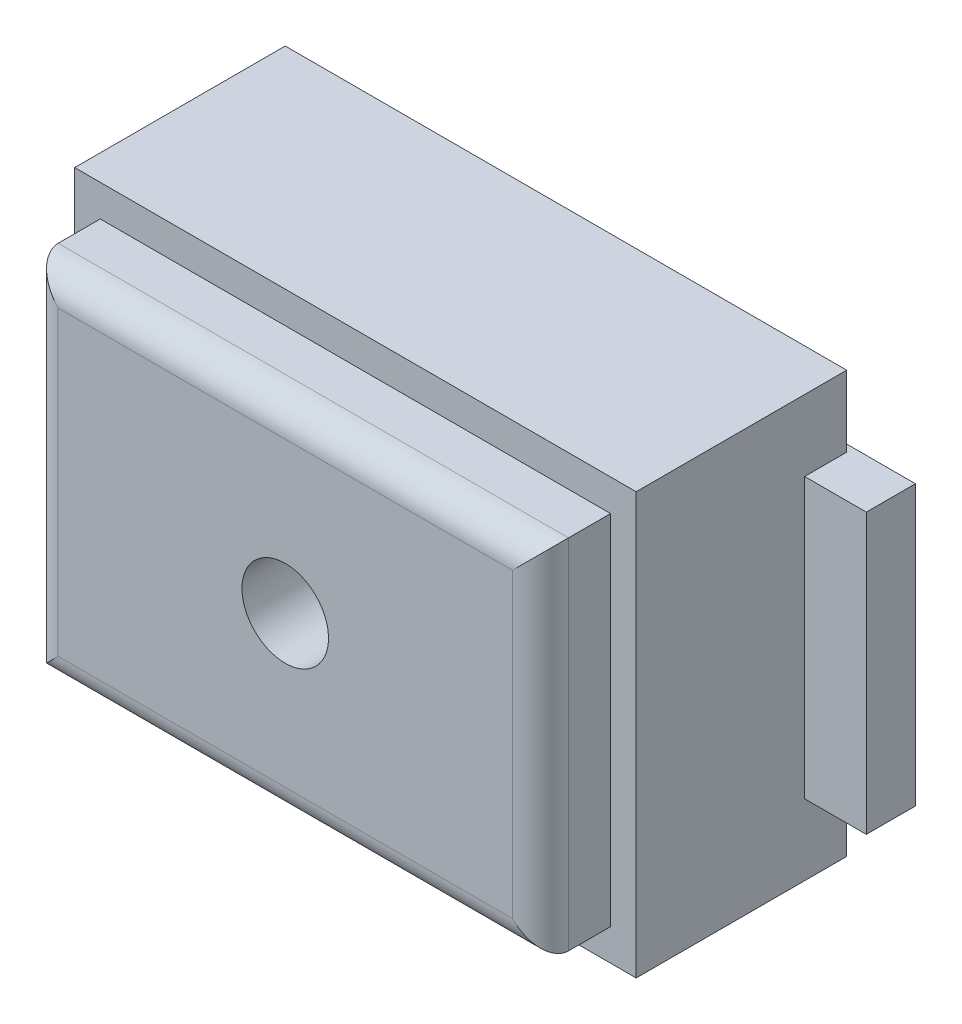
ISO-10303-21;
HEADER;
FILE_DESCRIPTION(('STEP AP214'),'2;1');
FILE_NAME('part.step','',(''),(''),'','','');
FILE_SCHEMA(('AUTOMOTIVE_DESIGN { 1 0 10303 214 1 1 1 1 }'));
ENDSEC;
DATA;
#1=APPLICATION_CONTEXT('core data for automotive mechanical design processes');
#2=APPLICATION_PROTOCOL_DEFINITION('international standard','automotive_design',2000,#1);
#3=PRODUCT_CONTEXT('',#1,'mechanical');
#4=PRODUCT('Part','Part','',(#3));
#5=PRODUCT_RELATED_PRODUCT_CATEGORY('part','',(#4));
#6=PRODUCT_DEFINITION_FORMATION('','',#4);
#7=PRODUCT_DEFINITION_CONTEXT('part definition',#1,'design');
#8=PRODUCT_DEFINITION('design','',#6,#7);
#9=PRODUCT_DEFINITION_SHAPE('','',#8);
#10=(LENGTH_UNIT() NAMED_UNIT(*) SI_UNIT(.MILLI.,.METRE.));
#11=(NAMED_UNIT(*) PLANE_ANGLE_UNIT() SI_UNIT($,.RADIAN.));
#12=(NAMED_UNIT(*) SI_UNIT($,.STERADIAN.) SOLID_ANGLE_UNIT());
#13=UNCERTAINTY_MEASURE_WITH_UNIT(LENGTH_MEASURE(1.E-05),#10,'distance_accuracy_value','');
#14=(GEOMETRIC_REPRESENTATION_CONTEXT(3) GLOBAL_UNCERTAINTY_ASSIGNED_CONTEXT((#13)) GLOBAL_UNIT_ASSIGNED_CONTEXT((#10,
#11,#12)) REPRESENTATION_CONTEXT('',''));
#15=CARTESIAN_POINT('',(0.,0.,0.));
#16=DIRECTION('',(0.,0.,1.));
#17=DIRECTION('',(1.,0.,0.));
#18=AXIS2_PLACEMENT_3D('',#15,#16,#17);
#19=CARTESIAN_POINT('',(0.,0.,1.5));
#20=DIRECTION('',(0.,0.,1.));
#21=DIRECTION('',(1.,0.,0.));
#22=AXIS2_PLACEMENT_3D('',#19,#20,#21);
#23=PLANE('',#22);
#24=DIRECTION('',(0.,-1.,0.));
#25=VECTOR('',#24,1.);
#26=CARTESIAN_POINT('',(-2.00000000000002,-1.50000000000001,1.5));
#27=LINE('',#26,#25);
#28=CARTESIAN_POINT('',(-2.00000000000002,1.5,1.5));
#29=VERTEX_POINT('',#28);
#30=CARTESIAN_POINT('',(-2.00000000000002,-1.50000000000001,1.5));
#31=VERTEX_POINT('',#30);
#32=EDGE_CURVE('E290',#29,#31,#27,.T.);
#33=ORIENTED_EDGE('',*,*,#32,.T.);
#34=DIRECTION('',(1.,0.,0.));
#35=VECTOR('',#34,1.);
#36=CARTESIAN_POINT('',(1.99999999999999,-1.5,1.5));
#37=LINE('',#36,#35);
#38=CARTESIAN_POINT('',(1.99999999999999,-1.5,1.5));
#39=VERTEX_POINT('',#38);
#40=EDGE_CURVE('E293',#31,#39,#37,.T.);
#41=ORIENTED_EDGE('',*,*,#40,.T.);
#42=DIRECTION('',(0.,1.,0.));
#43=VECTOR('',#42,1.);
#44=CARTESIAN_POINT('',(1.99999999999999,-1.5,1.5));
#45=LINE('',#44,#43);
#46=CARTESIAN_POINT('',(1.99999999999999,1.5,1.5));
#47=VERTEX_POINT('',#46);
#48=EDGE_CURVE('E296',#39,#47,#45,.T.);
#49=ORIENTED_EDGE('',*,*,#48,.T.);
#50=DIRECTION('',(-1.,0.,0.));
#51=VECTOR('',#50,1.);
#52=CARTESIAN_POINT('',(1.99999999999999,1.5,1.5));
#53=LINE('',#52,#51);
#54=EDGE_CURVE('E298',#47,#29,#53,.T.);
#55=ORIENTED_EDGE('',*,*,#54,.T.);
#56=EDGE_LOOP('',(#33,#41,#49,#55));
#57=FACE_BOUND('',#56,.T.);
#58=DIRECTION('',(0.,-1.,0.));
#59=VECTOR('',#58,1.);
#60=CARTESIAN_POINT('',(1.8176505170228,0.,1.5));
#61=LINE('',#60,#59);
#62=CARTESIAN_POINT('',(1.8176505170228,1.27419757527779,1.5));
#63=VERTEX_POINT('',#62);
#64=CARTESIAN_POINT('',(1.8176505170228,-1.27419757527779,1.5));
#65=VERTEX_POINT('',#64);
#66=EDGE_CURVE('E278',#63,#65,#61,.T.);
#67=ORIENTED_EDGE('',*,*,#66,.T.);
#68=DIRECTION('',(-1.,0.,0.));
#69=VECTOR('',#68,1.);
#70=CARTESIAN_POINT('',(0.,-1.27419757527779,1.5));
#71=LINE('',#70,#69);
#72=CARTESIAN_POINT('',(-1.8176505170228,-1.27419757527779,1.5));
#73=VERTEX_POINT('',#72);
#74=EDGE_CURVE('E268',#65,#73,#71,.T.);
#75=ORIENTED_EDGE('',*,*,#74,.T.);
#76=DIRECTION('',(0.,1.,0.));
#77=VECTOR('',#76,1.);
#78=CARTESIAN_POINT('',(-1.8176505170228,0.,1.5));
#79=LINE('',#78,#77);
#80=CARTESIAN_POINT('',(-1.8176505170228,1.27419757527779,1.5));
#81=VERTEX_POINT('',#80);
#82=EDGE_CURVE('E271',#73,#81,#79,.T.);
#83=ORIENTED_EDGE('',*,*,#82,.T.);
#84=DIRECTION('',(1.,0.,0.));
#85=VECTOR('',#84,1.);
#86=CARTESIAN_POINT('',(0.,1.27419757527779,1.5));
#87=LINE('',#86,#85);
#88=EDGE_CURVE('E275',#81,#63,#87,.T.);
#89=ORIENTED_EDGE('',*,*,#88,.T.);
#90=EDGE_LOOP('',(#67,#75,#83,#89));
#91=FACE_BOUND('',#90,.T.);
#92=ADVANCED_FACE('F35',(#57,#91),#23,.T.);
#93=CARTESIAN_POINT('',(-2.00000000000002,-1.50000000000001,1.5));
#94=DIRECTION('',(1.,0.,0.));
#95=DIRECTION('',(0.,0.,-1.));
#96=AXIS2_PLACEMENT_3D('',#93,#94,#95);
#97=PLANE('',#96);
#98=DIRECTION('',(0.,1.,0.));
#99=VECTOR('',#98,1.);
#100=CARTESIAN_POINT('',(-2.00000000000002,-1.50000000000001,0.3));
#101=LINE('',#100,#99);
#102=CARTESIAN_POINT('',(-2.00000000000002,-0.99421686042956,0.3));
#103=VERTEX_POINT('',#102);
#104=CARTESIAN_POINT('',(-2.00000000000002,0.994216860429553,0.3));
#105=VERTEX_POINT('',#104);
#106=EDGE_CURVE('E11',#103,#105,#101,.T.);
#107=ORIENTED_EDGE('',*,*,#106,.F.);
#108=DIRECTION('',(0.,0.,-1.));
#109=VECTOR('',#108,1.);
#110=CARTESIAN_POINT('',(-2.00000000000002,-0.99421686042956,1.5));
#111=LINE('',#110,#109);
#112=CARTESIAN_POINT('',(-2.00000000000002,-0.99421686042956,0.));
#113=VERTEX_POINT('',#112);
#114=EDGE_CURVE('E224',#103,#113,#111,.T.);
#115=ORIENTED_EDGE('',*,*,#114,.T.);
#116=DIRECTION('',(0.,-1.,0.));
#117=VECTOR('',#116,1.);
#118=CARTESIAN_POINT('',(-2.00000000000002,-1.50000000000001,0.));
#119=LINE('',#118,#117);
#120=CARTESIAN_POINT('',(-2.00000000000002,-1.50000000000001,0.));
#121=VERTEX_POINT('',#120);
#122=EDGE_CURVE('E284',#113,#121,#119,.T.);
#123=ORIENTED_EDGE('',*,*,#122,.T.);
#124=DIRECTION('',(0.,0.,-1.));
#125=VECTOR('',#124,1.);
#126=CARTESIAN_POINT('',(-2.00000000000002,-1.50000000000001,1.5));
#127=LINE('',#126,#125);
#128=EDGE_CURVE('E319',#31,#121,#127,.T.);
#129=ORIENTED_EDGE('',*,*,#128,.F.);
#130=ORIENTED_EDGE('',*,*,#32,.F.);
#131=DIRECTION('',(0.,0.,-1.));
#132=VECTOR('',#131,1.);
#133=CARTESIAN_POINT('',(-2.00000000000002,1.5,1.5));
#134=LINE('',#133,#132);
#135=CARTESIAN_POINT('',(-2.00000000000002,1.5,0.));
#136=VERTEX_POINT('',#135);
#137=EDGE_CURVE('E300',#29,#136,#134,.T.);
#138=ORIENTED_EDGE('',*,*,#137,.T.);
#139=CARTESIAN_POINT('',(-2.00000000000002,0.994216860429553,0.));
#140=VERTEX_POINT('',#139);
#141=EDGE_CURVE('E301',#136,#140,#119,.T.);
#142=ORIENTED_EDGE('',*,*,#141,.T.);
#143=DIRECTION('',(0.,0.,1.));
#144=VECTOR('',#143,1.);
#145=CARTESIAN_POINT('',(-2.00000000000002,0.994216860429553,1.5));
#146=LINE('',#145,#144);
#147=EDGE_CURVE('E50',#140,#105,#146,.T.);
#148=ORIENTED_EDGE('',*,*,#147,.T.);
#149=EDGE_LOOP('',(#107,#115,#123,#129,#130,#138,#142,#148));
#150=FACE_BOUND('',#149,.T.);
#151=ADVANCED_FACE('F371',(#150),#97,.F.);
#152=CARTESIAN_POINT('',(1.99999999999999,-1.5,1.5));
#153=DIRECTION('',(0.,1.,0.));
#154=DIRECTION('',(-1.,0.,0.));
#155=AXIS2_PLACEMENT_3D('',#152,#153,#154);
#156=PLANE('',#155);
#157=DIRECTION('',(1.,0.,0.));
#158=VECTOR('',#157,1.);
#159=CARTESIAN_POINT('',(1.99999999999999,-1.5,0.));
#160=LINE('',#159,#158);
#161=CARTESIAN_POINT('',(1.99999999999999,-1.5,0.));
#162=VERTEX_POINT('',#161);
#163=EDGE_CURVE('E304',#121,#162,#160,.T.);
#164=ORIENTED_EDGE('',*,*,#163,.T.);
#165=DIRECTION('',(0.,0.,-1.));
#166=VECTOR('',#165,1.);
#167=CARTESIAN_POINT('',(1.99999999999999,-1.5,1.5));
#168=LINE('',#167,#166);
#169=EDGE_CURVE('E316',#39,#162,#168,.T.);
#170=ORIENTED_EDGE('',*,*,#169,.F.);
#171=ORIENTED_EDGE('',*,*,#40,.F.);
#172=ORIENTED_EDGE('',*,*,#128,.T.);
#173=EDGE_LOOP('',(#164,#170,#171,#172));
#174=FACE_BOUND('',#173,.T.);
#175=ADVANCED_FACE('F398',(#174),#156,.F.);
#176=CARTESIAN_POINT('',(1.99999999999999,-1.5,1.5));
#177=DIRECTION('',(-1.,0.,0.));
#178=DIRECTION('',(0.,0.,1.));
#179=AXIS2_PLACEMENT_3D('',#176,#177,#178);
#180=PLANE('',#179);
#181=DIRECTION('',(0.,1.,0.));
#182=VECTOR('',#181,1.);
#183=CARTESIAN_POINT('',(1.99999999999999,-1.5,0.));
#184=LINE('',#183,#182);
#185=CARTESIAN_POINT('',(1.99999999999999,-0.99421686042956,0.));
#186=VERTEX_POINT('',#185);
#187=EDGE_CURVE('E307',#162,#186,#184,.T.);
#188=ORIENTED_EDGE('',*,*,#187,.T.);
#189=DIRECTION('',(0.,0.,1.));
#190=VECTOR('',#189,1.);
#191=CARTESIAN_POINT('',(1.99999999999999,-0.99421686042956,1.5));
#192=LINE('',#191,#190);
#193=CARTESIAN_POINT('',(1.99999999999999,-0.99421686042956,0.3));
#194=VERTEX_POINT('',#193);
#195=EDGE_CURVE('E258',#186,#194,#192,.T.);
#196=ORIENTED_EDGE('',*,*,#195,.T.);
#197=DIRECTION('',(0.,-1.,0.));
#198=VECTOR('',#197,1.);
#199=CARTESIAN_POINT('',(1.99999999999999,-1.5,0.3));
#200=LINE('',#199,#198);
#201=CARTESIAN_POINT('',(1.99999999999999,0.994216860429553,0.3));
#202=VERTEX_POINT('',#201);
#203=EDGE_CURVE('E357',#202,#194,#200,.T.);
#204=ORIENTED_EDGE('',*,*,#203,.F.);
#205=DIRECTION('',(0.,0.,-1.));
#206=VECTOR('',#205,1.);
#207=CARTESIAN_POINT('',(1.99999999999999,0.994216860429553,1.5));
#208=LINE('',#207,#206);
#209=CARTESIAN_POINT('',(1.99999999999999,0.994216860429553,0.));
#210=VERTEX_POINT('',#209);
#211=EDGE_CURVE('E250',#202,#210,#208,.T.);
#212=ORIENTED_EDGE('',*,*,#211,.T.);
#213=CARTESIAN_POINT('',(1.99999999999999,1.5,0.));
#214=VERTEX_POINT('',#213);
#215=EDGE_CURVE('E306',#210,#214,#184,.T.);
#216=ORIENTED_EDGE('',*,*,#215,.T.);
#217=DIRECTION('',(0.,0.,-1.));
#218=VECTOR('',#217,1.);
#219=CARTESIAN_POINT('',(1.99999999999999,1.5,1.5));
#220=LINE('',#219,#218);
#221=EDGE_CURVE('E313',#47,#214,#220,.T.);
#222=ORIENTED_EDGE('',*,*,#221,.F.);
#223=ORIENTED_EDGE('',*,*,#48,.F.);
#224=ORIENTED_EDGE('',*,*,#169,.T.);
#225=EDGE_LOOP('',(#188,#196,#204,#212,#216,#222,#223,#224));
#226=FACE_BOUND('',#225,.T.);
#227=ADVANCED_FACE('F410',(#226),#180,.F.);
#228=CARTESIAN_POINT('',(1.99999999999999,1.5,1.5));
#229=DIRECTION('',(0.,-1.,0.));
#230=DIRECTION('',(1.,0.,0.));
#231=AXIS2_PLACEMENT_3D('',#228,#229,#230);
#232=PLANE('',#231);
#233=DIRECTION('',(-1.,0.,0.));
#234=VECTOR('',#233,1.);
#235=CARTESIAN_POINT('',(1.99999999999999,1.5,0.));
#236=LINE('',#235,#234);
#237=EDGE_CURVE('E294',#214,#136,#236,.T.);
#238=ORIENTED_EDGE('',*,*,#237,.T.);
#239=ORIENTED_EDGE('',*,*,#137,.F.);
#240=ORIENTED_EDGE('',*,*,#54,.F.);
#241=ORIENTED_EDGE('',*,*,#221,.T.);
#242=EDGE_LOOP('',(#238,#239,#240,#241));
#243=FACE_BOUND('',#242,.T.);
#244=ADVANCED_FACE('F407',(#243),#232,.F.);
#245=CARTESIAN_POINT('',(0.,0.,0.));
#246=DIRECTION('',(0.,0.,1.));
#247=DIRECTION('',(1.,0.,0.));
#248=AXIS2_PLACEMENT_3D('',#245,#246,#247);
#249=PLANE('',#248);
#250=ORIENTED_EDGE('',*,*,#122,.F.);
#251=DIRECTION('',(1.,0.,0.));
#252=VECTOR('',#251,1.);
#253=CARTESIAN_POINT('',(0.,-0.99421686042956,0.));
#254=LINE('',#253,#252);
#255=CARTESIAN_POINT('',(-1.58269945819022,-0.99421686042956,0.));
#256=VERTEX_POINT('',#255);
#257=EDGE_CURVE('E43',#113,#256,#254,.T.);
#258=ORIENTED_EDGE('',*,*,#257,.T.);
#259=DIRECTION('',(0.,1.,0.));
#260=VECTOR('',#259,1.);
#261=CARTESIAN_POINT('',(-1.58269945819022,0.,0.));
#262=LINE('',#261,#260);
#263=CARTESIAN_POINT('',(-1.58269945819022,0.994216860429553,0.));
#264=VERTEX_POINT('',#263);
#265=EDGE_CURVE('E361',#256,#264,#262,.T.);
#266=ORIENTED_EDGE('',*,*,#265,.T.);
#267=DIRECTION('',(-1.,0.,0.));
#268=VECTOR('',#267,1.);
#269=CARTESIAN_POINT('',(0.,0.994216860429553,0.));
#270=LINE('',#269,#268);
#271=EDGE_CURVE('E359',#264,#140,#270,.T.);
#272=ORIENTED_EDGE('',*,*,#271,.T.);
#273=ORIENTED_EDGE('',*,*,#141,.F.);
#274=ORIENTED_EDGE('',*,*,#237,.F.);
#275=ORIENTED_EDGE('',*,*,#215,.F.);
#276=DIRECTION('',(-1.,0.,0.));
#277=VECTOR('',#276,1.);
#278=CARTESIAN_POINT('',(0.,0.994216860429553,0.));
#279=LINE('',#278,#277);
#280=CARTESIAN_POINT('',(1.56042903451278,0.994216860429553,0.));
#281=VERTEX_POINT('',#280);
#282=EDGE_CURVE('E340',#210,#281,#279,.T.);
#283=ORIENTED_EDGE('',*,*,#282,.T.);
#284=DIRECTION('',(0.,-1.,0.));
#285=VECTOR('',#284,1.);
#286=CARTESIAN_POINT('',(1.56042903451278,0.,0.));
#287=LINE('',#286,#285);
#288=CARTESIAN_POINT('',(1.56042903451278,-0.99421686042956,0.));
#289=VERTEX_POINT('',#288);
#290=EDGE_CURVE('E351',#281,#289,#287,.T.);
#291=ORIENTED_EDGE('',*,*,#290,.T.);
#292=DIRECTION('',(1.,0.,0.));
#293=VECTOR('',#292,1.);
#294=CARTESIAN_POINT('',(0.,-0.99421686042956,0.));
#295=LINE('',#294,#293);
#296=EDGE_CURVE('E354',#289,#186,#295,.T.);
#297=ORIENTED_EDGE('',*,*,#296,.T.);
#298=ORIENTED_EDGE('',*,*,#187,.F.);
#299=ORIENTED_EDGE('',*,*,#163,.F.);
#300=EDGE_LOOP('',(#250,#258,#266,#272,#273,#274,#275,#283,#291,#297,#298,#299));
#301=FACE_BOUND('',#300,.T.);
#302=ADVANCED_FACE('F366',(#301),#249,.F.);
#303=CARTESIAN_POINT('',(0.,-1.27419757527779,2.));
#304=DIRECTION('',(0.,-1.,0.));
#305=DIRECTION('',(0.,0.,-1.));
#306=AXIS2_PLACEMENT_3D('',#303,#304,#305);
#307=PLANE('',#306);
#308=DIRECTION('',(0.,0.,-1.));
#309=VECTOR('',#308,1.);
#310=CARTESIAN_POINT('',(1.8176505170228,-1.27419757527779,2.));
#311=LINE('',#310,#309);
#312=CARTESIAN_POINT('',(1.8176505170228,-1.27419757527779,1.8));
#313=VERTEX_POINT('',#312);
#314=EDGE_CURVE('E282',#313,#65,#311,.T.);
#315=ORIENTED_EDGE('',*,*,#314,.F.);
#316=DIRECTION('',(-1.,0.,0.));
#317=VECTOR('',#316,1.);
#318=CARTESIAN_POINT('',(-1.8176505170228,-1.27419757527779,1.8));
#319=LINE('',#318,#317);
#320=CARTESIAN_POINT('',(-1.8176505170228,-1.27419757527779,1.8));
#321=VERTEX_POINT('',#320);
#322=EDGE_CURVE('E334',#313,#321,#319,.T.);
#323=ORIENTED_EDGE('',*,*,#322,.T.);
#324=DIRECTION('',(0.,0.,-1.));
#325=VECTOR('',#324,1.);
#326=CARTESIAN_POINT('',(-1.8176505170228,-1.27419757527779,2.));
#327=LINE('',#326,#325);
#328=EDGE_CURVE('E281',#321,#73,#327,.T.);
#329=ORIENTED_EDGE('',*,*,#328,.T.);
#330=ORIENTED_EDGE('',*,*,#74,.F.);
#331=EDGE_LOOP('',(#315,#323,#329,#330));
#332=FACE_BOUND('',#331,.T.);
#333=ADVANCED_FACE('F403',(#332),#307,.T.);
#334=CARTESIAN_POINT('',(1.8176505170228,0.,2.));
#335=DIRECTION('',(1.,0.,0.));
#336=DIRECTION('',(0.,0.,-1.));
#337=AXIS2_PLACEMENT_3D('',#334,#335,#336);
#338=PLANE('',#337);
#339=DIRECTION('',(0.,0.,-1.));
#340=VECTOR('',#339,1.);
#341=CARTESIAN_POINT('',(1.8176505170228,1.27419757527779,2.));
#342=LINE('',#341,#340);
#343=CARTESIAN_POINT('',(1.8176505170228,1.27419757527779,1.8));
#344=VERTEX_POINT('',#343);
#345=EDGE_CURVE('E285',#344,#63,#342,.T.);
#346=ORIENTED_EDGE('',*,*,#345,.F.);
#347=DIRECTION('',(0.,-1.,0.));
#348=VECTOR('',#347,1.);
#349=CARTESIAN_POINT('',(1.8176505170228,-1.27419757527779,1.8));
#350=LINE('',#349,#348);
#351=EDGE_CURVE('E322',#344,#313,#350,.T.);
#352=ORIENTED_EDGE('',*,*,#351,.T.);
#353=ORIENTED_EDGE('',*,*,#314,.T.);
#354=ORIENTED_EDGE('',*,*,#66,.F.);
#355=EDGE_LOOP('',(#346,#352,#353,#354));
#356=FACE_BOUND('',#355,.T.);
#357=ADVANCED_FACE('F452',(#356),#338,.T.);
#358=CARTESIAN_POINT('',(0.,1.27419757527779,2.));
#359=DIRECTION('',(0.,1.,0.));
#360=DIRECTION('',(0.,0.,1.));
#361=AXIS2_PLACEMENT_3D('',#358,#359,#360);
#362=PLANE('',#361);
#363=DIRECTION('',(0.,0.,-1.));
#364=VECTOR('',#363,1.);
#365=CARTESIAN_POINT('',(-1.8176505170228,1.27419757527779,2.));
#366=LINE('',#365,#364);
#367=CARTESIAN_POINT('',(-1.8176505170228,1.27419757527779,1.8));
#368=VERTEX_POINT('',#367);
#369=EDGE_CURVE('E287',#368,#81,#366,.T.);
#370=ORIENTED_EDGE('',*,*,#369,.F.);
#371=DIRECTION('',(1.,0.,0.));
#372=VECTOR('',#371,1.);
#373=CARTESIAN_POINT('',(1.8176505170228,1.27419757527779,1.8));
#374=LINE('',#373,#372);
#375=EDGE_CURVE('E338',#368,#344,#374,.T.);
#376=ORIENTED_EDGE('',*,*,#375,.T.);
#377=ORIENTED_EDGE('',*,*,#345,.T.);
#378=ORIENTED_EDGE('',*,*,#88,.F.);
#379=EDGE_LOOP('',(#370,#376,#377,#378));
#380=FACE_BOUND('',#379,.T.);
#381=ADVANCED_FACE('F459',(#380),#362,.T.);
#382=CARTESIAN_POINT('',(-1.8176505170228,0.,2.));
#383=DIRECTION('',(-1.,0.,0.));
#384=DIRECTION('',(0.,0.,1.));
#385=AXIS2_PLACEMENT_3D('',#382,#383,#384);
#386=PLANE('',#385);
#387=ORIENTED_EDGE('',*,*,#328,.F.);
#388=DIRECTION('',(0.,1.,0.));
#389=VECTOR('',#388,1.);
#390=CARTESIAN_POINT('',(-1.8176505170228,1.27419757527779,1.8));
#391=LINE('',#390,#389);
#392=EDGE_CURVE('E336',#321,#368,#391,.T.);
#393=ORIENTED_EDGE('',*,*,#392,.T.);
#394=ORIENTED_EDGE('',*,*,#369,.T.);
#395=ORIENTED_EDGE('',*,*,#82,.F.);
#396=EDGE_LOOP('',(#387,#393,#394,#395));
#397=FACE_BOUND('',#396,.T.);
#398=ADVANCED_FACE('F461',(#397),#386,.T.);
#399=CARTESIAN_POINT('',(0.,0.,2.));
#400=DIRECTION('',(0.,0.,-1.));
#401=DIRECTION('',(-1.,0.,0.));
#402=AXIS2_PLACEMENT_3D('',#399,#400,#401);
#403=PLANE('',#402);
#404=CARTESIAN_POINT('',(0.,0.,2.));
#405=DIRECTION('',(0.,0.,-1.));
#406=DIRECTION('',(-1.,0.,0.));
#407=AXIS2_PLACEMENT_3D('',#404,#405,#406);
#408=CIRCLE('',#407,0.308254007567541);
#409=CARTESIAN_POINT('',(-0.308254007567541,0.,2.));
#410=VERTEX_POINT('',#409);
#411=EDGE_CURVE('E261',#410,#410,#408,.T.);
#412=ORIENTED_EDGE('',*,*,#411,.T.);
#413=EDGE_LOOP('',(#412));
#414=FACE_BOUND('',#413,.T.);
#415=DIRECTION('',(-1.,0.,0.));
#416=VECTOR('',#415,1.);
#417=CARTESIAN_POINT('',(1.8176505170228,-1.07419757527779,2.));
#418=LINE('',#417,#416);
#419=CARTESIAN_POINT('',(-1.6176505170228,-1.07419757527779,2.));
#420=VERTEX_POINT('',#419);
#421=CARTESIAN_POINT('',(1.6176505170228,-1.07419757527779,2.));
#422=VERTEX_POINT('',#421);
#423=EDGE_CURVE('E329',#420,#422,#418,.F.);
#424=ORIENTED_EDGE('',*,*,#423,.T.);
#425=DIRECTION('',(0.,-1.,0.));
#426=VECTOR('',#425,1.);
#427=CARTESIAN_POINT('',(1.6176505170228,1.27419757527779,2.));
#428=LINE('',#427,#426);
#429=CARTESIAN_POINT('',(1.6176505170228,1.07419757527779,2.));
#430=VERTEX_POINT('',#429);
#431=EDGE_CURVE('E331',#422,#430,#428,.F.);
#432=ORIENTED_EDGE('',*,*,#431,.T.);
#433=DIRECTION('',(1.,0.,0.));
#434=VECTOR('',#433,1.);
#435=CARTESIAN_POINT('',(-1.8176505170228,1.07419757527779,2.));
#436=LINE('',#435,#434);
#437=CARTESIAN_POINT('',(-1.6176505170228,1.07419757527779,2.));
#438=VERTEX_POINT('',#437);
#439=EDGE_CURVE('E325',#430,#438,#436,.F.);
#440=ORIENTED_EDGE('',*,*,#439,.T.);
#441=DIRECTION('',(0.,1.,0.));
#442=VECTOR('',#441,1.);
#443=CARTESIAN_POINT('',(-1.6176505170228,-1.27419757527779,2.));
#444=LINE('',#443,#442);
#445=EDGE_CURVE('E327',#438,#420,#444,.F.);
#446=ORIENTED_EDGE('',*,*,#445,.T.);
#447=EDGE_LOOP('',(#424,#432,#440,#446));
#448=FACE_BOUND('',#447,.T.);
#449=ADVANCED_FACE('F432',(#414,#448),#403,.F.);
#450=CARTESIAN_POINT('',(-1.6176505170228,0.,1.8));
#451=DIRECTION('',(0.,-1.,0.));
#452=DIRECTION('',(0.,0.,-1.));
#453=AXIS2_PLACEMENT_3D('',#450,#451,#452);
#454=CYLINDRICAL_SURFACE('',#453,0.2);
#455=CARTESIAN_POINT('',(-1.6176505170228,-1.07419757527779,1.8));
#456=DIRECTION('',(0.707106781186547,-0.707106781186547,0.));
#457=DIRECTION('',(-0.707106781186547,-0.707106781186547,0.));
#458=AXIS2_PLACEMENT_3D('',#455,#456,#457);
#459=ELLIPSE('',#458,0.282842712474619,0.2);
#460=EDGE_CURVE('E344',#420,#321,#459,.T.);
#461=ORIENTED_EDGE('',*,*,#460,.F.);
#462=ORIENTED_EDGE('',*,*,#445,.F.);
#463=CARTESIAN_POINT('',(-1.6176505170228,1.07419757527779,1.8));
#464=DIRECTION('',(-0.707106781186547,-0.707106781186547,0.));
#465=DIRECTION('',(-0.707106781186547,0.707106781186547,0.));
#466=AXIS2_PLACEMENT_3D('',#463,#464,#465);
#467=ELLIPSE('',#466,0.282842712474619,0.2);
#468=EDGE_CURVE('E272',#368,#438,#467,.F.);
#469=ORIENTED_EDGE('',*,*,#468,.F.);
#470=ORIENTED_EDGE('',*,*,#392,.F.);
#471=EDGE_LOOP('',(#461,#462,#469,#470));
#472=FACE_BOUND('',#471,.T.);
#473=ADVANCED_FACE('F37',(#472),#454,.T.);
#474=CARTESIAN_POINT('',(0.,1.07419757527779,1.8));
#475=DIRECTION('',(-1.,0.,0.));
#476=DIRECTION('',(0.,0.,1.));
#477=AXIS2_PLACEMENT_3D('',#474,#475,#476);
#478=CYLINDRICAL_SURFACE('',#477,0.2);
#479=ORIENTED_EDGE('',*,*,#468,.T.);
#480=ORIENTED_EDGE('',*,*,#439,.F.);
#481=CARTESIAN_POINT('',(1.6176505170228,1.07419757527779,1.8));
#482=DIRECTION('',(-0.707106781186547,0.707106781186547,0.));
#483=DIRECTION('',(-0.707106781186547,-0.707106781186547,0.));
#484=AXIS2_PLACEMENT_3D('',#481,#482,#483);
#485=ELLIPSE('',#484,0.282842712474619,0.2);
#486=EDGE_CURVE('E342',#344,#430,#485,.F.);
#487=ORIENTED_EDGE('',*,*,#486,.F.);
#488=ORIENTED_EDGE('',*,*,#375,.F.);
#489=EDGE_LOOP('',(#479,#480,#487,#488));
#490=FACE_BOUND('',#489,.T.);
#491=ADVANCED_FACE('F425',(#490),#478,.T.);
#492=CARTESIAN_POINT('',(0.,-1.07419757527779,1.8));
#493=DIRECTION('',(1.,0.,0.));
#494=DIRECTION('',(0.,0.,-1.));
#495=AXIS2_PLACEMENT_3D('',#492,#493,#494);
#496=CYLINDRICAL_SURFACE('',#495,0.2);
#497=ORIENTED_EDGE('',*,*,#460,.T.);
#498=ORIENTED_EDGE('',*,*,#322,.F.);
#499=CARTESIAN_POINT('',(1.6176505170228,-1.07419757527779,1.8));
#500=DIRECTION('',(0.707106781186547,0.707106781186547,0.));
#501=DIRECTION('',(0.707106781186547,-0.707106781186547,0.));
#502=AXIS2_PLACEMENT_3D('',#499,#500,#501);
#503=ELLIPSE('',#502,0.282842712474619,0.2);
#504=EDGE_CURVE('E265',#422,#313,#503,.T.);
#505=ORIENTED_EDGE('',*,*,#504,.F.);
#506=ORIENTED_EDGE('',*,*,#423,.F.);
#507=EDGE_LOOP('',(#497,#498,#505,#506));
#508=FACE_BOUND('',#507,.T.);
#509=ADVANCED_FACE('F422',(#508),#496,.T.);
#510=CARTESIAN_POINT('',(1.6176505170228,0.,1.8));
#511=DIRECTION('',(0.,1.,0.));
#512=DIRECTION('',(0.,0.,1.));
#513=AXIS2_PLACEMENT_3D('',#510,#511,#512);
#514=CYLINDRICAL_SURFACE('',#513,0.2);
#515=ORIENTED_EDGE('',*,*,#486,.T.);
#516=ORIENTED_EDGE('',*,*,#431,.F.);
#517=ORIENTED_EDGE('',*,*,#504,.T.);
#518=ORIENTED_EDGE('',*,*,#351,.F.);
#519=EDGE_LOOP('',(#515,#516,#517,#518));
#520=FACE_BOUND('',#519,.T.);
#521=ADVANCED_FACE('F418',(#520),#514,.T.);
#522=CARTESIAN_POINT('',(0.,0.,1.5));
#523=DIRECTION('',(0.,0.,1.));
#524=DIRECTION('',(1.,0.,0.));
#525=AXIS2_PLACEMENT_3D('',#522,#523,#524);
#526=CYLINDRICAL_SURFACE('',#525,0.308254007567541);
#527=CARTESIAN_POINT('',(0.,0.,1.5));
#528=DIRECTION('',(0.,0.,-1.));
#529=DIRECTION('',(-1.,0.,0.));
#530=AXIS2_PLACEMENT_3D('',#527,#528,#529);
#531=CIRCLE('',#530,0.308254007567541);
#532=CARTESIAN_POINT('',(-0.308254007567541,0.,1.5));
#533=VERTEX_POINT('',#532);
#534=EDGE_CURVE('E262',#533,#533,#531,.T.);
#535=ORIENTED_EDGE('',*,*,#534,.T.);
#536=EDGE_LOOP('',(#535));
#537=FACE_BOUND('',#536,.T.);
#538=ORIENTED_EDGE('',*,*,#411,.F.);
#539=EDGE_LOOP('',(#538));
#540=FACE_BOUND('',#539,.T.);
#541=ADVANCED_FACE('F421',(#537,#540),#526,.F.);
#542=CARTESIAN_POINT('',(0.,0.,1.5));
#543=DIRECTION('',(0.,0.,-1.));
#544=DIRECTION('',(-1.,0.,0.));
#545=AXIS2_PLACEMENT_3D('',#542,#543,#544);
#546=PLANE('',#545);
#547=ORIENTED_EDGE('',*,*,#534,.F.);
#548=EDGE_LOOP('',(#547));
#549=FACE_BOUND('',#548,.T.);
#550=ADVANCED_FACE('F475',(#549),#546,.F.);
#551=CARTESIAN_POINT('',(0.,0.,0.3));
#552=DIRECTION('',(0.,0.,-1.));
#553=DIRECTION('',(-1.,0.,0.));
#554=AXIS2_PLACEMENT_3D('',#551,#552,#553);
#555=PLANE('',#554);
#556=DIRECTION('',(-1.,0.,0.));
#557=VECTOR('',#556,1.);
#558=CARTESIAN_POINT('',(1.56042903451278,0.994216860429553,0.3));
#559=LINE('',#558,#557);
#560=CARTESIAN_POINT('',(2.43957096548719,0.994216860429553,0.3));
#561=VERTEX_POINT('',#560);
#562=EDGE_CURVE('E230',#561,#202,#559,.T.);
#563=ORIENTED_EDGE('',*,*,#562,.T.);
#564=ORIENTED_EDGE('',*,*,#203,.T.);
#565=DIRECTION('',(1.,0.,0.));
#566=VECTOR('',#565,1.);
#567=CARTESIAN_POINT('',(1.56042903451278,-0.99421686042956,0.3));
#568=LINE('',#567,#566);
#569=CARTESIAN_POINT('',(2.43957096548719,-0.99421686042956,0.3));
#570=VERTEX_POINT('',#569);
#571=EDGE_CURVE('E233',#194,#570,#568,.T.);
#572=ORIENTED_EDGE('',*,*,#571,.T.);
#573=DIRECTION('',(0.,1.,0.));
#574=VECTOR('',#573,1.);
#575=CARTESIAN_POINT('',(2.43957096548719,-0.99421686042956,0.3));
#576=LINE('',#575,#574);
#577=EDGE_CURVE('E227',#570,#561,#576,.T.);
#578=ORIENTED_EDGE('',*,*,#577,.T.);
#579=EDGE_LOOP('',(#563,#564,#572,#578));
#580=FACE_BOUND('',#579,.T.);
#581=ADVANCED_FACE('F479',(#580),#555,.F.);
#582=CARTESIAN_POINT('',(1.56042903451278,-0.99421686042956,-0.05));
#583=DIRECTION('',(0.,-1.,0.));
#584=DIRECTION('',(0.,0.,-1.));
#585=AXIS2_PLACEMENT_3D('',#582,#583,#584);
#586=PLANE('',#585);
#587=ORIENTED_EDGE('',*,*,#195,.F.);
#588=ORIENTED_EDGE('',*,*,#296,.F.);
#589=DIRECTION('',(0.,0.,1.));
#590=VECTOR('',#589,1.);
#591=CARTESIAN_POINT('',(1.56042903451278,-0.99421686042956,-0.05));
#592=LINE('',#591,#590);
#593=CARTESIAN_POINT('',(1.56042903451278,-0.99421686042956,-0.05));
#594=VERTEX_POINT('',#593);
#595=EDGE_CURVE('E251',#594,#289,#592,.T.);
#596=ORIENTED_EDGE('',*,*,#595,.F.);
#597=DIRECTION('',(1.,0.,0.));
#598=VECTOR('',#597,1.);
#599=CARTESIAN_POINT('',(1.56042903451278,-0.99421686042956,-0.05));
#600=LINE('',#599,#598);
#601=CARTESIAN_POINT('',(2.43957096548719,-0.99421686042956,-0.05));
#602=VERTEX_POINT('',#601);
#603=EDGE_CURVE('E243',#594,#602,#600,.T.);
#604=ORIENTED_EDGE('',*,*,#603,.T.);
#605=DIRECTION('',(0.,0.,1.));
#606=VECTOR('',#605,1.);
#607=CARTESIAN_POINT('',(2.43957096548719,-0.99421686042956,-0.05));
#608=LINE('',#607,#606);
#609=EDGE_CURVE('E247',#602,#570,#608,.T.);
#610=ORIENTED_EDGE('',*,*,#609,.T.);
#611=ORIENTED_EDGE('',*,*,#571,.F.);
#612=EDGE_LOOP('',(#587,#588,#596,#604,#610,#611));
#613=FACE_BOUND('',#612,.T.);
#614=ADVANCED_FACE('F492',(#613),#586,.T.);
#615=CARTESIAN_POINT('',(1.56042903451278,-0.99421686042956,-0.05));
#616=DIRECTION('',(-1.,0.,0.));
#617=DIRECTION('',(0.,0.,1.));
#618=AXIS2_PLACEMENT_3D('',#615,#616,#617);
#619=PLANE('',#618);
#620=ORIENTED_EDGE('',*,*,#290,.F.);
#621=DIRECTION('',(0.,0.,1.));
#622=VECTOR('',#621,1.);
#623=CARTESIAN_POINT('',(1.56042903451278,0.994216860429553,-0.05));
#624=LINE('',#623,#622);
#625=CARTESIAN_POINT('',(1.56042903451278,0.994216860429553,-0.05));
#626=VERTEX_POINT('',#625);
#627=EDGE_CURVE('E58',#626,#281,#624,.T.);
#628=ORIENTED_EDGE('',*,*,#627,.F.);
#629=DIRECTION('',(0.,-1.,0.));
#630=VECTOR('',#629,1.);
#631=CARTESIAN_POINT('',(1.56042903451278,-0.99421686042956,-0.05));
#632=LINE('',#631,#630);
#633=EDGE_CURVE('E240',#626,#594,#632,.T.);
#634=ORIENTED_EDGE('',*,*,#633,.T.);
#635=ORIENTED_EDGE('',*,*,#595,.T.);
#636=EDGE_LOOP('',(#620,#628,#634,#635));
#637=FACE_BOUND('',#636,.T.);
#638=ADVANCED_FACE('F489',(#637),#619,.T.);
#639=CARTESIAN_POINT('',(1.56042903451278,0.994216860429553,-0.05));
#640=DIRECTION('',(0.,1.,0.));
#641=DIRECTION('',(0.,0.,1.));
#642=AXIS2_PLACEMENT_3D('',#639,#640,#641);
#643=PLANE('',#642);
#644=ORIENTED_EDGE('',*,*,#211,.F.);
#645=ORIENTED_EDGE('',*,*,#562,.F.);
#646=DIRECTION('',(0.,0.,1.));
#647=VECTOR('',#646,1.);
#648=CARTESIAN_POINT('',(2.43957096548719,0.994216860429553,-0.05));
#649=LINE('',#648,#647);
#650=CARTESIAN_POINT('',(2.43957096548719,0.994216860429553,-0.05));
#651=VERTEX_POINT('',#650);
#652=EDGE_CURVE('E246',#651,#561,#649,.T.);
#653=ORIENTED_EDGE('',*,*,#652,.F.);
#654=DIRECTION('',(-1.,0.,0.));
#655=VECTOR('',#654,1.);
#656=CARTESIAN_POINT('',(1.56042903451278,0.994216860429553,-0.05));
#657=LINE('',#656,#655);
#658=EDGE_CURVE('E238',#651,#626,#657,.T.);
#659=ORIENTED_EDGE('',*,*,#658,.T.);
#660=ORIENTED_EDGE('',*,*,#627,.T.);
#661=ORIENTED_EDGE('',*,*,#282,.F.);
#662=EDGE_LOOP('',(#644,#645,#653,#659,#660,#661));
#663=FACE_BOUND('',#662,.T.);
#664=ADVANCED_FACE('F485',(#663),#643,.T.);
#665=CARTESIAN_POINT('',(2.43957096548719,-0.99421686042956,-0.05));
#666=DIRECTION('',(1.,0.,0.));
#667=DIRECTION('',(0.,0.,-1.));
#668=AXIS2_PLACEMENT_3D('',#665,#666,#667);
#669=PLANE('',#668);
#670=ORIENTED_EDGE('',*,*,#652,.T.);
#671=ORIENTED_EDGE('',*,*,#577,.F.);
#672=ORIENTED_EDGE('',*,*,#609,.F.);
#673=DIRECTION('',(0.,1.,0.));
#674=VECTOR('',#673,1.);
#675=CARTESIAN_POINT('',(2.43957096548719,-0.99421686042956,-0.05));
#676=LINE('',#675,#674);
#677=EDGE_CURVE('E235',#602,#651,#676,.T.);
#678=ORIENTED_EDGE('',*,*,#677,.T.);
#679=EDGE_LOOP('',(#670,#671,#672,#678));
#680=FACE_BOUND('',#679,.T.);
#681=ADVANCED_FACE('F481',(#680),#669,.T.);
#682=CARTESIAN_POINT('',(0.,0.,-0.05));
#683=DIRECTION('',(0.,0.,-1.));
#684=DIRECTION('',(-1.,0.,0.));
#685=AXIS2_PLACEMENT_3D('',#682,#683,#684);
#686=PLANE('',#685);
#687=ORIENTED_EDGE('',*,*,#677,.F.);
#688=ORIENTED_EDGE('',*,*,#603,.F.);
#689=ORIENTED_EDGE('',*,*,#633,.F.);
#690=ORIENTED_EDGE('',*,*,#658,.F.);
#691=EDGE_LOOP('',(#687,#688,#689,#690));
#692=FACE_BOUND('',#691,.T.);
#693=ADVANCED_FACE('F484',(#692),#686,.T.);
#694=CARTESIAN_POINT('',(0.,0.,0.3));
#695=DIRECTION('',(0.,0.,-1.));
#696=DIRECTION('',(-1.,0.,0.));
#697=AXIS2_PLACEMENT_3D('',#694,#695,#696);
#698=PLANE('',#697);
#699=DIRECTION('',(1.,0.,0.));
#700=VECTOR('',#699,1.);
#701=CARTESIAN_POINT('',(-2.45059161204089,-0.99421686042956,0.3));
#702=LINE('',#701,#700);
#703=CARTESIAN_POINT('',(-2.45059161204089,-0.99421686042956,0.3));
#704=VERTEX_POINT('',#703);
#705=EDGE_CURVE('E204',#704,#103,#702,.T.);
#706=ORIENTED_EDGE('',*,*,#705,.T.);
#707=ORIENTED_EDGE('',*,*,#106,.T.);
#708=DIRECTION('',(-1.,0.,0.));
#709=VECTOR('',#708,1.);
#710=CARTESIAN_POINT('',(-2.45059161204089,0.994216860429553,0.3));
#711=LINE('',#710,#709);
#712=CARTESIAN_POINT('',(-2.45059161204089,0.994216860429553,0.3));
#713=VERTEX_POINT('',#712);
#714=EDGE_CURVE('E183',#105,#713,#711,.T.);
#715=ORIENTED_EDGE('',*,*,#714,.T.);
#716=DIRECTION('',(0.,-1.,0.));
#717=VECTOR('',#716,1.);
#718=CARTESIAN_POINT('',(-2.45059161204089,-0.99421686042956,0.3));
#719=LINE('',#718,#717);
#720=EDGE_CURVE('E188',#713,#704,#719,.T.);
#721=ORIENTED_EDGE('',*,*,#720,.T.);
#722=EDGE_LOOP('',(#706,#707,#715,#721));
#723=FACE_BOUND('',#722,.T.);
#724=ADVANCED_FACE('F186',(#723),#698,.F.);
#725=CARTESIAN_POINT('',(-1.58269945819022,-0.99421686042956,-0.05));
#726=DIRECTION('',(1.,0.,0.));
#727=DIRECTION('',(0.,0.,-1.));
#728=AXIS2_PLACEMENT_3D('',#725,#726,#727);
#729=PLANE('',#728);
#730=ORIENTED_EDGE('',*,*,#265,.F.);
#731=DIRECTION('',(0.,0.,1.));
#732=VECTOR('',#731,1.);
#733=CARTESIAN_POINT('',(-1.58269945819022,-0.99421686042956,-0.05));
#734=LINE('',#733,#732);
#735=CARTESIAN_POINT('',(-1.58269945819022,-0.99421686042956,-0.05));
#736=VERTEX_POINT('',#735);
#737=EDGE_CURVE('E217',#736,#256,#734,.T.);
#738=ORIENTED_EDGE('',*,*,#737,.F.);
#739=DIRECTION('',(0.,1.,0.));
#740=VECTOR('',#739,1.);
#741=CARTESIAN_POINT('',(-1.58269945819022,-0.99421686042956,-0.05));
#742=LINE('',#741,#740);
#743=CARTESIAN_POINT('',(-1.58269945819022,0.994216860429553,-0.05));
#744=VERTEX_POINT('',#743);
#745=EDGE_CURVE('E206',#736,#744,#742,.T.);
#746=ORIENTED_EDGE('',*,*,#745,.T.);
#747=DIRECTION('',(0.,0.,1.));
#748=VECTOR('',#747,1.);
#749=CARTESIAN_POINT('',(-1.58269945819022,0.994216860429553,-0.05));
#750=LINE('',#749,#748);
#751=EDGE_CURVE('E201',#744,#264,#750,.T.);
#752=ORIENTED_EDGE('',*,*,#751,.T.);
#753=EDGE_LOOP('',(#730,#738,#746,#752));
#754=FACE_BOUND('',#753,.T.);
#755=ADVANCED_FACE('F379',(#754),#729,.T.);
#756=CARTESIAN_POINT('',(-2.45059161204089,-0.99421686042956,-0.05));
#757=DIRECTION('',(0.,-1.,0.));
#758=DIRECTION('',(0.,0.,-1.));
#759=AXIS2_PLACEMENT_3D('',#756,#757,#758);
#760=PLANE('',#759);
#761=ORIENTED_EDGE('',*,*,#114,.F.);
#762=ORIENTED_EDGE('',*,*,#705,.F.);
#763=DIRECTION('',(0.,0.,1.));
#764=VECTOR('',#763,1.);
#765=CARTESIAN_POINT('',(-2.45059161204089,-0.99421686042956,-0.05));
#766=LINE('',#765,#764);
#767=CARTESIAN_POINT('',(-2.45059161204089,-0.99421686042956,-0.05));
#768=VERTEX_POINT('',#767);
#769=EDGE_CURVE('E200',#768,#704,#766,.T.);
#770=ORIENTED_EDGE('',*,*,#769,.F.);
#771=DIRECTION('',(1.,0.,0.));
#772=VECTOR('',#771,1.);
#773=CARTESIAN_POINT('',(-2.45059161204089,-0.99421686042956,-0.05));
#774=LINE('',#773,#772);
#775=EDGE_CURVE('E214',#768,#736,#774,.T.);
#776=ORIENTED_EDGE('',*,*,#775,.T.);
#777=ORIENTED_EDGE('',*,*,#737,.T.);
#778=ORIENTED_EDGE('',*,*,#257,.F.);
#779=EDGE_LOOP('',(#761,#762,#770,#776,#777,#778));
#780=FACE_BOUND('',#779,.T.);
#781=ADVANCED_FACE('F369',(#780),#760,.T.);
#782=CARTESIAN_POINT('',(-2.45059161204089,0.994216860429553,-0.05));
#783=DIRECTION('',(0.,1.,0.));
#784=DIRECTION('',(0.,0.,1.));
#785=AXIS2_PLACEMENT_3D('',#782,#783,#784);
#786=PLANE('',#785);
#787=ORIENTED_EDGE('',*,*,#147,.F.);
#788=ORIENTED_EDGE('',*,*,#271,.F.);
#789=ORIENTED_EDGE('',*,*,#751,.F.);
#790=DIRECTION('',(-1.,0.,0.));
#791=VECTOR('',#790,1.);
#792=CARTESIAN_POINT('',(-2.45059161204089,0.994216860429553,-0.05));
#793=LINE('',#792,#791);
#794=CARTESIAN_POINT('',(-2.45059161204089,0.994216860429553,-0.05));
#795=VERTEX_POINT('',#794);
#796=EDGE_CURVE('E196',#744,#795,#793,.T.);
#797=ORIENTED_EDGE('',*,*,#796,.T.);
#798=DIRECTION('',(0.,0.,1.));
#799=VECTOR('',#798,1.);
#800=CARTESIAN_POINT('',(-2.45059161204089,0.994216860429553,-0.05));
#801=LINE('',#800,#799);
#802=EDGE_CURVE('E193',#795,#713,#801,.T.);
#803=ORIENTED_EDGE('',*,*,#802,.T.);
#804=ORIENTED_EDGE('',*,*,#714,.F.);
#805=EDGE_LOOP('',(#787,#788,#789,#797,#803,#804));
#806=FACE_BOUND('',#805,.T.);
#807=ADVANCED_FACE('F194',(#806),#786,.T.);
#808=CARTESIAN_POINT('',(-2.45059161204089,-0.99421686042956,-0.05));
#809=DIRECTION('',(-1.,0.,0.));
#810=DIRECTION('',(0.,0.,1.));
#811=AXIS2_PLACEMENT_3D('',#808,#809,#810);
#812=PLANE('',#811);
#813=ORIENTED_EDGE('',*,*,#769,.T.);
#814=ORIENTED_EDGE('',*,*,#720,.F.);
#815=ORIENTED_EDGE('',*,*,#802,.F.);
#816=DIRECTION('',(0.,-1.,0.));
#817=VECTOR('',#816,1.);
#818=CARTESIAN_POINT('',(-2.45059161204089,-0.99421686042956,-0.05));
#819=LINE('',#818,#817);
#820=EDGE_CURVE('E212',#795,#768,#819,.T.);
#821=ORIENTED_EDGE('',*,*,#820,.T.);
#822=EDGE_LOOP('',(#813,#814,#815,#821));
#823=FACE_BOUND('',#822,.T.);
#824=ADVANCED_FACE('F203',(#823),#812,.T.);
#825=CARTESIAN_POINT('',(0.,0.,-0.05));
#826=DIRECTION('',(0.,0.,-1.));
#827=DIRECTION('',(-1.,0.,0.));
#828=AXIS2_PLACEMENT_3D('',#825,#826,#827);
#829=PLANE('',#828);
#830=ORIENTED_EDGE('',*,*,#745,.F.);
#831=ORIENTED_EDGE('',*,*,#775,.F.);
#832=ORIENTED_EDGE('',*,*,#820,.F.);
#833=ORIENTED_EDGE('',*,*,#796,.F.);
#834=EDGE_LOOP('',(#830,#831,#832,#833));
#835=FACE_BOUND('',#834,.T.);
#836=ADVANCED_FACE('F383',(#835),#829,.T.);
#837=CLOSED_SHELL('',(#92,#151,#175,#227,#244,#302,#333,#357,#381,#398,#449,#473,#491,#509,#521,
#541,#550,#581,#614,#638,#664,#681,#693,#724,#755,#781,#807,#824,#836));
#838=MANIFOLD_SOLID_BREP('B2',#837);
#839=ADVANCED_BREP_SHAPE_REPRESENTATION('',(#18,#838),#14);
#840=SHAPE_DEFINITION_REPRESENTATION(#9,#839);
ENDSEC;
END-ISO-10303-21;
